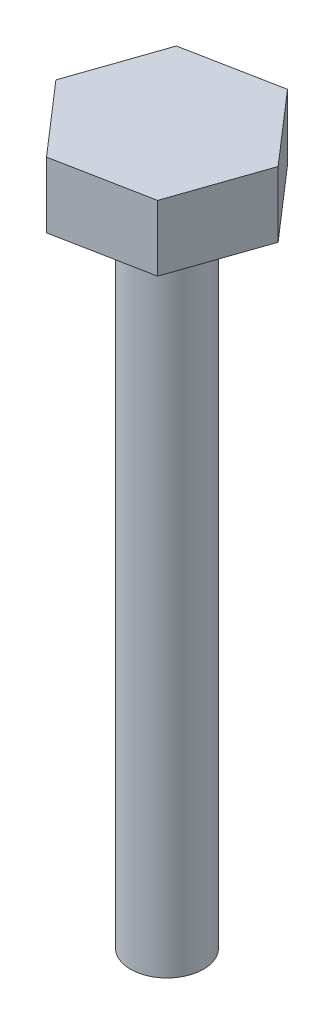
ISO-10303-21;
HEADER;
FILE_DESCRIPTION(('STEP AP214'),'2;1');
FILE_NAME('part.step','',(''),(''),'','','');
FILE_SCHEMA(('AUTOMOTIVE_DESIGN { 1 0 10303 214 1 1 1 1 }'));
ENDSEC;
DATA;
#1=APPLICATION_CONTEXT('core data for automotive mechanical design processes');
#2=APPLICATION_PROTOCOL_DEFINITION('international standard','automotive_design',2000,#1);
#3=PRODUCT_CONTEXT('',#1,'mechanical');
#4=PRODUCT('Part','Part','',(#3));
#5=PRODUCT_RELATED_PRODUCT_CATEGORY('part','',(#4));
#6=PRODUCT_DEFINITION_FORMATION('','',#4);
#7=PRODUCT_DEFINITION_CONTEXT('part definition',#1,'design');
#8=PRODUCT_DEFINITION('design','',#6,#7);
#9=PRODUCT_DEFINITION_SHAPE('','',#8);
#10=(LENGTH_UNIT() NAMED_UNIT(*) SI_UNIT(.MILLI.,.METRE.));
#11=(NAMED_UNIT(*) PLANE_ANGLE_UNIT() SI_UNIT($,.RADIAN.));
#12=(NAMED_UNIT(*) SI_UNIT($,.STERADIAN.) SOLID_ANGLE_UNIT());
#13=UNCERTAINTY_MEASURE_WITH_UNIT(LENGTH_MEASURE(1.E-05),#10,'distance_accuracy_value','');
#14=(GEOMETRIC_REPRESENTATION_CONTEXT(3) GLOBAL_UNCERTAINTY_ASSIGNED_CONTEXT((#13)) GLOBAL_UNIT_ASSIGNED_CONTEXT((#10,
#11,#12)) REPRESENTATION_CONTEXT('',''));
#15=CARTESIAN_POINT('',(0.,0.,0.));
#16=DIRECTION('',(0.,0.,1.));
#17=DIRECTION('',(1.,0.,0.));
#18=AXIS2_PLACEMENT_3D('',#15,#16,#17);
#19=CARTESIAN_POINT('',(0.,45.,0.));
#20=DIRECTION('',(0.,1.,0.));
#21=DIRECTION('',(0.,0.,1.));
#22=AXIS2_PLACEMENT_3D('',#19,#20,#21);
#23=PLANE('',#22);
#24=DIRECTION('',(0.981692340599434,0.,-0.19047348479094));
#25=VECTOR('',#24,1.);
#26=CARTESIAN_POINT('',(-21.1829340920219,45.,61.4514711235871));
#27=LINE('',#26,#25);
#28=CARTESIAN_POINT('',(-21.1829340920219,45.,61.4514711235871));
#29=VERTEX_POINT('',#28);
#30=CARTESIAN_POINT('',(42.6270680469413,45.,49.070694612176));
#31=VERTEX_POINT('',#30);
#32=EDGE_CURVE('E128',#29,#31,#27,.T.);
#33=ORIENTED_EDGE('',*,*,#32,.T.);
#34=DIRECTION('',(0.325891293723414,0.,-0.945407248055186));
#35=VECTOR('',#34,1.);
#36=CARTESIAN_POINT('',(42.6270680469413,45.,49.070694612176));
#37=LINE('',#36,#35);
#38=CARTESIAN_POINT('',(63.8100021389632,45.,-12.3807765114111));
#39=VERTEX_POINT('',#38);
#40=EDGE_CURVE('E87',#31,#39,#37,.T.);
#41=ORIENTED_EDGE('',*,*,#40,.T.);
#42=DIRECTION('',(-0.65580104687602,0.,-0.754933763264245));
#43=VECTOR('',#42,1.);
#44=CARTESIAN_POINT('',(63.8100021389632,45.,-12.3807765114111));
#45=LINE('',#44,#43);
#46=CARTESIAN_POINT('',(21.1829340920219,45.,-61.4514711235871));
#47=VERTEX_POINT('',#46);
#48=EDGE_CURVE('E99',#39,#47,#45,.T.);
#49=ORIENTED_EDGE('',*,*,#48,.T.);
#50=DIRECTION('',(-0.981692340599434,0.,0.19047348479094));
#51=VECTOR('',#50,1.);
#52=CARTESIAN_POINT('',(21.1829340920219,45.,-61.4514711235871));
#53=LINE('',#52,#51);
#54=CARTESIAN_POINT('',(-42.6270680469413,45.,-49.070694612176));
#55=VERTEX_POINT('',#54);
#56=EDGE_CURVE('E94',#47,#55,#53,.T.);
#57=ORIENTED_EDGE('',*,*,#56,.T.);
#58=DIRECTION('',(-0.325891293723414,0.,0.945407248055186));
#59=VECTOR('',#58,1.);
#60=CARTESIAN_POINT('',(-42.6270680469413,45.,-49.070694612176));
#61=LINE('',#60,#59);
#62=CARTESIAN_POINT('',(-63.8100021389632,45.,12.3807765114111));
#63=VERTEX_POINT('',#62);
#64=EDGE_CURVE('E97',#55,#63,#61,.T.);
#65=ORIENTED_EDGE('',*,*,#64,.T.);
#66=DIRECTION('',(0.65580104687602,0.,0.754933763264246));
#67=VECTOR('',#66,1.);
#68=CARTESIAN_POINT('',(-63.8100021389632,45.,12.3807765114111));
#69=LINE('',#68,#67);
#70=EDGE_CURVE('E50',#63,#29,#69,.T.);
#71=ORIENTED_EDGE('',*,*,#70,.T.);
#72=EDGE_LOOP('',(#33,#41,#49,#57,#65,#71));
#73=FACE_BOUND('',#72,.T.);
#74=ADVANCED_FACE('F33',(#73),#23,.T.);
#75=CARTESIAN_POINT('',(0.,0.,0.));
#76=DIRECTION('',(0.,1.,0.));
#77=DIRECTION('',(0.,0.,1.));
#78=AXIS2_PLACEMENT_3D('',#75,#76,#77);
#79=PLANE('',#78);
#80=DIRECTION('',(0.981692340599434,0.,-0.19047348479094));
#81=VECTOR('',#80,1.);
#82=CARTESIAN_POINT('',(-21.1829340920219,0.,61.4514711235871));
#83=LINE('',#82,#81);
#84=CARTESIAN_POINT('',(-21.1829340920219,0.,61.4514711235871));
#85=VERTEX_POINT('',#84);
#86=CARTESIAN_POINT('',(42.6270680469413,0.,49.070694612176));
#87=VERTEX_POINT('',#86);
#88=EDGE_CURVE('E117',#85,#87,#83,.T.);
#89=ORIENTED_EDGE('',*,*,#88,.F.);
#90=DIRECTION('',(0.65580104687602,0.,0.754933763264246));
#91=VECTOR('',#90,1.);
#92=CARTESIAN_POINT('',(-63.8100021389632,0.,12.3807765114111));
#93=LINE('',#92,#91);
#94=CARTESIAN_POINT('',(-63.8100021389632,0.,12.3807765114111));
#95=VERTEX_POINT('',#94);
#96=EDGE_CURVE('E79',#95,#85,#93,.T.);
#97=ORIENTED_EDGE('',*,*,#96,.F.);
#98=DIRECTION('',(-0.325891293723414,0.,0.945407248055186));
#99=VECTOR('',#98,1.);
#100=CARTESIAN_POINT('',(-42.6270680469413,0.,-49.070694612176));
#101=LINE('',#100,#99);
#102=CARTESIAN_POINT('',(-42.6270680469413,0.,-49.070694612176));
#103=VERTEX_POINT('',#102);
#104=EDGE_CURVE('E73',#103,#95,#101,.T.);
#105=ORIENTED_EDGE('',*,*,#104,.F.);
#106=DIRECTION('',(-0.981692340599434,0.,0.19047348479094));
#107=VECTOR('',#106,1.);
#108=CARTESIAN_POINT('',(21.1829340920219,0.,-61.4514711235871));
#109=LINE('',#108,#107);
#110=CARTESIAN_POINT('',(21.1829340920219,0.,-61.4514711235871));
#111=VERTEX_POINT('',#110);
#112=EDGE_CURVE('E107',#111,#103,#109,.T.);
#113=ORIENTED_EDGE('',*,*,#112,.F.);
#114=DIRECTION('',(-0.65580104687602,0.,-0.754933763264245));
#115=VECTOR('',#114,1.);
#116=CARTESIAN_POINT('',(63.8100021389632,0.,-12.3807765114111));
#117=LINE('',#116,#115);
#118=CARTESIAN_POINT('',(63.8100021389632,0.,-12.3807765114111));
#119=VERTEX_POINT('',#118);
#120=EDGE_CURVE('E123',#119,#111,#117,.T.);
#121=ORIENTED_EDGE('',*,*,#120,.F.);
#122=DIRECTION('',(0.325891293723414,0.,-0.945407248055186));
#123=VECTOR('',#122,1.);
#124=CARTESIAN_POINT('',(42.6270680469413,0.,49.070694612176));
#125=LINE('',#124,#123);
#126=EDGE_CURVE('E120',#87,#119,#125,.T.);
#127=ORIENTED_EDGE('',*,*,#126,.F.);
#128=EDGE_LOOP('',(#89,#97,#105,#113,#121,#127));
#129=FACE_BOUND('',#128,.T.);
#130=CARTESIAN_POINT('',(0.,0.,0.));
#131=DIRECTION('',(0.,1.,0.));
#132=DIRECTION('',(0.,0.,1.));
#133=AXIS2_PLACEMENT_3D('',#130,#131,#132);
#134=CIRCLE('',#133,25.);
#135=CARTESIAN_POINT('',(0.,0.,25.));
#136=VERTEX_POINT('',#135);
#137=EDGE_CURVE('E121',#136,#136,#134,.T.);
#138=ORIENTED_EDGE('',*,*,#137,.T.);
#139=EDGE_LOOP('',(#138));
#140=FACE_BOUND('',#139,.T.);
#141=ADVANCED_FACE('F137',(#129,#140),#79,.F.);
#142=CARTESIAN_POINT('',(-21.1829340920219,45.,61.4514711235871));
#143=DIRECTION('',(-0.19047348479094,0.,-0.981692340599434));
#144=DIRECTION('',(-0.981692340599434,0.,0.19047348479094));
#145=AXIS2_PLACEMENT_3D('',#142,#143,#144);
#146=PLANE('',#145);
#147=ORIENTED_EDGE('',*,*,#88,.T.);
#148=DIRECTION('',(0.,-1.,0.));
#149=VECTOR('',#148,1.);
#150=CARTESIAN_POINT('',(42.6270680469413,45.,49.070694612176));
#151=LINE('',#150,#149);
#152=EDGE_CURVE('E11',#31,#87,#151,.T.);
#153=ORIENTED_EDGE('',*,*,#152,.F.);
#154=ORIENTED_EDGE('',*,*,#32,.F.);
#155=DIRECTION('',(0.,-1.,0.));
#156=VECTOR('',#155,1.);
#157=CARTESIAN_POINT('',(-21.1829340920219,45.,61.4514711235871));
#158=LINE('',#157,#156);
#159=EDGE_CURVE('E113',#29,#85,#158,.T.);
#160=ORIENTED_EDGE('',*,*,#159,.T.);
#161=EDGE_LOOP('',(#147,#153,#154,#160));
#162=FACE_BOUND('',#161,.T.);
#163=ADVANCED_FACE('F35',(#162),#146,.F.);
#164=CARTESIAN_POINT('',(42.6270680469413,45.,49.070694612176));
#165=DIRECTION('',(-0.945407248055186,0.,-0.325891293723414));
#166=DIRECTION('',(-0.325891293723414,0.,0.945407248055186));
#167=AXIS2_PLACEMENT_3D('',#164,#165,#166);
#168=PLANE('',#167);
#169=ORIENTED_EDGE('',*,*,#126,.T.);
#170=DIRECTION('',(0.,-1.,0.));
#171=VECTOR('',#170,1.);
#172=CARTESIAN_POINT('',(63.8100021389632,45.,-12.3807765114111));
#173=LINE('',#172,#171);
#174=EDGE_CURVE('E42',#39,#119,#173,.T.);
#175=ORIENTED_EDGE('',*,*,#174,.F.);
#176=ORIENTED_EDGE('',*,*,#40,.F.);
#177=ORIENTED_EDGE('',*,*,#152,.T.);
#178=EDGE_LOOP('',(#169,#175,#176,#177));
#179=FACE_BOUND('',#178,.T.);
#180=ADVANCED_FACE('F211',(#179),#168,.F.);
#181=CARTESIAN_POINT('',(63.8100021389632,45.,-12.3807765114111));
#182=DIRECTION('',(-0.754933763264245,0.,0.65580104687602));
#183=DIRECTION('',(0.65580104687602,0.,0.754933763264245));
#184=AXIS2_PLACEMENT_3D('',#181,#182,#183);
#185=PLANE('',#184);
#186=ORIENTED_EDGE('',*,*,#120,.T.);
#187=DIRECTION('',(0.,-1.,0.));
#188=VECTOR('',#187,1.);
#189=CARTESIAN_POINT('',(21.1829340920219,45.,-61.4514711235871));
#190=LINE('',#189,#188);
#191=EDGE_CURVE('E108',#47,#111,#190,.T.);
#192=ORIENTED_EDGE('',*,*,#191,.F.);
#193=ORIENTED_EDGE('',*,*,#48,.F.);
#194=ORIENTED_EDGE('',*,*,#174,.T.);
#195=EDGE_LOOP('',(#186,#192,#193,#194));
#196=FACE_BOUND('',#195,.T.);
#197=ADVANCED_FACE('F134',(#196),#185,.F.);
#198=CARTESIAN_POINT('',(21.1829340920219,45.,-61.4514711235871));
#199=DIRECTION('',(0.19047348479094,0.,0.981692340599434));
#200=DIRECTION('',(0.981692340599434,0.,-0.19047348479094));
#201=AXIS2_PLACEMENT_3D('',#198,#199,#200);
#202=PLANE('',#201);
#203=ORIENTED_EDGE('',*,*,#112,.T.);
#204=DIRECTION('',(0.,-1.,0.));
#205=VECTOR('',#204,1.);
#206=CARTESIAN_POINT('',(-42.6270680469413,45.,-49.070694612176));
#207=LINE('',#206,#205);
#208=EDGE_CURVE('E104',#55,#103,#207,.T.);
#209=ORIENTED_EDGE('',*,*,#208,.F.);
#210=ORIENTED_EDGE('',*,*,#56,.F.);
#211=ORIENTED_EDGE('',*,*,#191,.T.);
#212=EDGE_LOOP('',(#203,#209,#210,#211));
#213=FACE_BOUND('',#212,.T.);
#214=ADVANCED_FACE('F105',(#213),#202,.F.);
#215=CARTESIAN_POINT('',(-42.6270680469413,45.,-49.070694612176));
#216=DIRECTION('',(0.945407248055186,0.,0.325891293723414));
#217=DIRECTION('',(0.325891293723414,0.,-0.945407248055186));
#218=AXIS2_PLACEMENT_3D('',#215,#216,#217);
#219=PLANE('',#218);
#220=ORIENTED_EDGE('',*,*,#104,.T.);
#221=DIRECTION('',(0.,-1.,0.));
#222=VECTOR('',#221,1.);
#223=CARTESIAN_POINT('',(-63.8100021389632,45.,12.3807765114111));
#224=LINE('',#223,#222);
#225=EDGE_CURVE('E109',#63,#95,#224,.T.);
#226=ORIENTED_EDGE('',*,*,#225,.F.);
#227=ORIENTED_EDGE('',*,*,#64,.F.);
#228=ORIENTED_EDGE('',*,*,#208,.T.);
#229=EDGE_LOOP('',(#220,#226,#227,#228));
#230=FACE_BOUND('',#229,.T.);
#231=ADVANCED_FACE('F111',(#230),#219,.F.);
#232=CARTESIAN_POINT('',(-63.8100021389632,45.,12.3807765114111));
#233=DIRECTION('',(0.754933763264246,0.,-0.65580104687602));
#234=DIRECTION('',(-0.65580104687602,0.,-0.754933763264246));
#235=AXIS2_PLACEMENT_3D('',#232,#233,#234);
#236=PLANE('',#235);
#237=ORIENTED_EDGE('',*,*,#96,.T.);
#238=ORIENTED_EDGE('',*,*,#159,.F.);
#239=ORIENTED_EDGE('',*,*,#70,.F.);
#240=ORIENTED_EDGE('',*,*,#225,.T.);
#241=EDGE_LOOP('',(#237,#238,#239,#240));
#242=FACE_BOUND('',#241,.T.);
#243=ADVANCED_FACE('F142',(#242),#236,.F.);
#244=CARTESIAN_POINT('',(0.,-445.,0.));
#245=DIRECTION('',(0.,1.,0.));
#246=DIRECTION('',(0.,0.,1.));
#247=AXIS2_PLACEMENT_3D('',#244,#245,#246);
#248=CYLINDRICAL_SURFACE('',#247,25.);
#249=CARTESIAN_POINT('',(0.,-445.,0.));
#250=DIRECTION('',(0.,1.,0.));
#251=DIRECTION('',(0.,0.,1.));
#252=AXIS2_PLACEMENT_3D('',#249,#250,#251);
#253=CIRCLE('',#252,25.);
#254=CARTESIAN_POINT('',(0.,-445.,25.));
#255=VERTEX_POINT('',#254);
#256=EDGE_CURVE('E167',#255,#255,#253,.T.);
#257=ORIENTED_EDGE('',*,*,#256,.T.);
#258=EDGE_LOOP('',(#257));
#259=FACE_BOUND('',#258,.T.);
#260=ORIENTED_EDGE('',*,*,#137,.F.);
#261=EDGE_LOOP('',(#260));
#262=FACE_BOUND('',#261,.T.);
#263=ADVANCED_FACE('F144',(#259,#262),#248,.T.);
#264=CARTESIAN_POINT('',(0.,-445.,0.));
#265=DIRECTION('',(0.,1.,0.));
#266=DIRECTION('',(0.,0.,1.));
#267=AXIS2_PLACEMENT_3D('',#264,#265,#266);
#268=PLANE('',#267);
#269=ORIENTED_EDGE('',*,*,#256,.F.);
#270=EDGE_LOOP('',(#269));
#271=FACE_BOUND('',#270,.T.);
#272=ADVANCED_FACE('F150',(#271),#268,.F.);
#273=CLOSED_SHELL('',(#74,#141,#163,#180,#197,#214,#231,#243,#263,#272));
#274=MANIFOLD_SOLID_BREP('B2',#273);
#275=ADVANCED_BREP_SHAPE_REPRESENTATION('',(#18,#274),#14);
#276=SHAPE_DEFINITION_REPRESENTATION(#9,#275);
ENDSEC;
END-ISO-10303-21;
